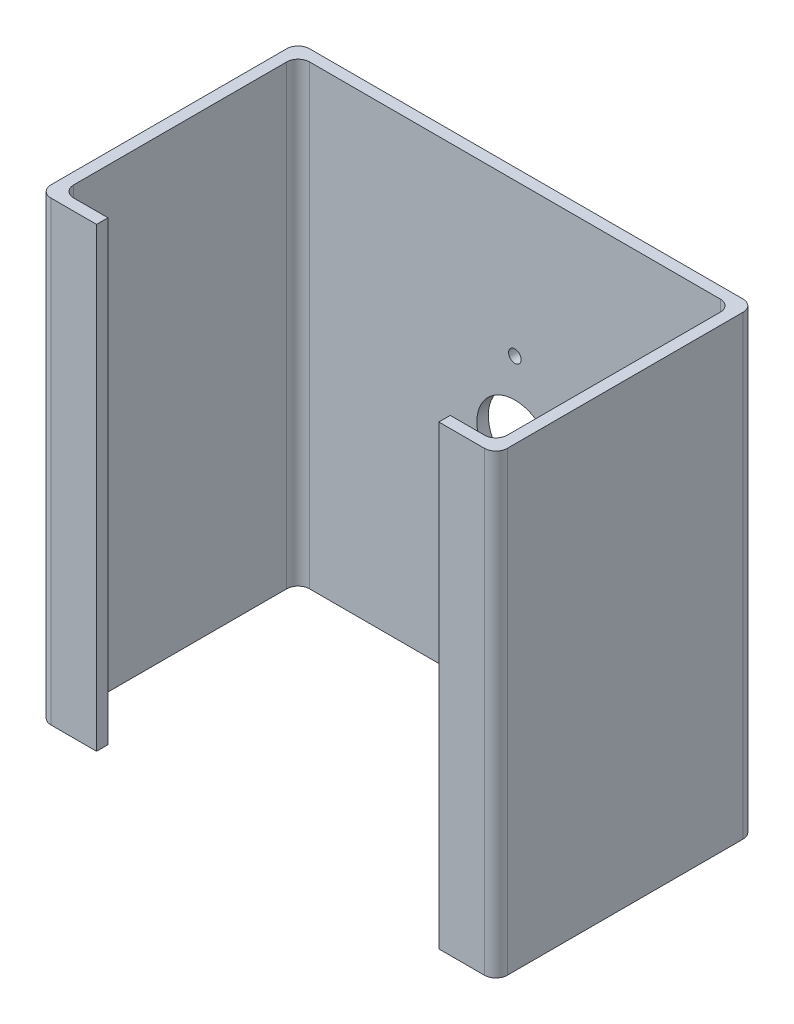
ISO-10303-21;
HEADER;
FILE_DESCRIPTION(('STEP AP214'),'2;1');
FILE_NAME('part.step','',(''),(''),'','','');
FILE_SCHEMA(('AUTOMOTIVE_DESIGN { 1 0 10303 214 1 1 1 1 }'));
ENDSEC;
DATA;
#1=APPLICATION_CONTEXT('core data for automotive mechanical design processes');
#2=APPLICATION_PROTOCOL_DEFINITION('international standard','automotive_design',2000,#1);
#3=PRODUCT_CONTEXT('',#1,'mechanical');
#4=PRODUCT('Part','Part','',(#3));
#5=PRODUCT_RELATED_PRODUCT_CATEGORY('part','',(#4));
#6=PRODUCT_DEFINITION_FORMATION('','',#4);
#7=PRODUCT_DEFINITION_CONTEXT('part definition',#1,'design');
#8=PRODUCT_DEFINITION('design','',#6,#7);
#9=PRODUCT_DEFINITION_SHAPE('','',#8);
#10=(LENGTH_UNIT() NAMED_UNIT(*) SI_UNIT(.MILLI.,.METRE.));
#11=(NAMED_UNIT(*) PLANE_ANGLE_UNIT() SI_UNIT($,.RADIAN.));
#12=(NAMED_UNIT(*) SI_UNIT($,.STERADIAN.) SOLID_ANGLE_UNIT());
#13=UNCERTAINTY_MEASURE_WITH_UNIT(LENGTH_MEASURE(1.E-05),#10,'distance_accuracy_value','');
#14=(GEOMETRIC_REPRESENTATION_CONTEXT(3) GLOBAL_UNCERTAINTY_ASSIGNED_CONTEXT((#13)) GLOBAL_UNIT_ASSIGNED_CONTEXT((#10,
#11,#12)) REPRESENTATION_CONTEXT('',''));
#15=CARTESIAN_POINT('',(0.,0.,0.));
#16=DIRECTION('',(0.,0.,1.));
#17=DIRECTION('',(1.,0.,0.));
#18=AXIS2_PLACEMENT_3D('',#15,#16,#17);
#19=CARTESIAN_POINT('',(0.,-120.,3.00000000000002));
#20=DIRECTION('',(1.,0.,0.));
#21=DIRECTION('',(0.,0.,-1.));
#22=AXIS2_PLACEMENT_3D('',#19,#20,#21);
#23=PLANE('',#22);
#24=DIRECTION('',(0.,0.,-1.));
#25=VECTOR('',#24,1.);
#26=CARTESIAN_POINT('',(0.,0.,3.00000000000002));
#27=LINE('',#26,#25);
#28=CARTESIAN_POINT('',(0.,0.,3.00000000000002));
#29=VERTEX_POINT('',#28);
#30=CARTESIAN_POINT('',(0.,0.,0.));
#31=VERTEX_POINT('',#30);
#32=EDGE_CURVE('E229',#29,#31,#27,.T.);
#33=ORIENTED_EDGE('',*,*,#32,.F.);
#34=DIRECTION('',(0.,1.,0.));
#35=VECTOR('',#34,1.);
#36=CARTESIAN_POINT('',(0.,-120.,3.00000000000002));
#37=LINE('',#36,#35);
#38=CARTESIAN_POINT('',(0.,-120.,3.00000000000002));
#39=VERTEX_POINT('',#38);
#40=EDGE_CURVE('E195',#39,#29,#37,.T.);
#41=ORIENTED_EDGE('',*,*,#40,.F.);
#42=DIRECTION('',(0.,0.,-1.));
#43=VECTOR('',#42,1.);
#44=CARTESIAN_POINT('',(0.,-120.,3.00000000000002));
#45=LINE('',#44,#43);
#46=CARTESIAN_POINT('',(0.,-120.,0.));
#47=VERTEX_POINT('',#46);
#48=EDGE_CURVE('E190',#39,#47,#45,.T.);
#49=ORIENTED_EDGE('',*,*,#48,.T.);
#50=DIRECTION('',(0.,1.,0.));
#51=VECTOR('',#50,1.);
#52=CARTESIAN_POINT('',(0.,-120.,0.));
#53=LINE('',#52,#51);
#54=EDGE_CURVE('E172',#47,#31,#53,.T.);
#55=ORIENTED_EDGE('',*,*,#54,.T.);
#56=EDGE_LOOP('',(#33,#41,#49,#55));
#57=FACE_BOUND('',#56,.T.);
#58=ADVANCED_FACE('F36',(#57),#23,.T.);
#59=CARTESIAN_POINT('',(-15.,-120.,3.00000000000002));
#60=DIRECTION('',(0.,0.,1.));
#61=DIRECTION('',(1.,0.,0.));
#62=AXIS2_PLACEMENT_3D('',#59,#60,#61);
#63=PLANE('',#62);
#64=DIRECTION('',(1.,0.,0.));
#65=VECTOR('',#64,1.);
#66=CARTESIAN_POINT('',(-15.,0.,3.00000000000002));
#67=LINE('',#66,#65);
#68=CARTESIAN_POINT('',(-12.,0.,3.00000000000002));
#69=VERTEX_POINT('',#68);
#70=EDGE_CURVE('E196',#69,#29,#67,.T.);
#71=ORIENTED_EDGE('',*,*,#70,.F.);
#72=DIRECTION('',(0.,1.,0.));
#73=VECTOR('',#72,1.);
#74=CARTESIAN_POINT('',(-12.,-120.,3.00000000000002));
#75=LINE('',#74,#73);
#76=CARTESIAN_POINT('',(-12.,-120.,3.00000000000002));
#77=VERTEX_POINT('',#76);
#78=EDGE_CURVE('E318',#69,#77,#75,.F.);
#79=ORIENTED_EDGE('',*,*,#78,.T.);
#80=DIRECTION('',(1.,0.,0.));
#81=VECTOR('',#80,1.);
#82=CARTESIAN_POINT('',(-15.,-120.,3.00000000000002));
#83=LINE('',#82,#81);
#84=EDGE_CURVE('E184',#77,#39,#83,.T.);
#85=ORIENTED_EDGE('',*,*,#84,.T.);
#86=ORIENTED_EDGE('',*,*,#40,.T.);
#87=EDGE_LOOP('',(#71,#79,#85,#86));
#88=FACE_BOUND('',#87,.T.);
#89=ADVANCED_FACE('F359',(#88),#63,.T.);
#90=CARTESIAN_POINT('',(-15.,-120.,-65.));
#91=DIRECTION('',(-1.,0.,0.));
#92=DIRECTION('',(0.,0.,1.));
#93=AXIS2_PLACEMENT_3D('',#90,#91,#92);
#94=PLANE('',#93);
#95=DIRECTION('',(0.,0.,1.));
#96=VECTOR('',#95,1.);
#97=CARTESIAN_POINT('',(-15.,-120.,-65.));
#98=LINE('',#97,#96);
#99=CARTESIAN_POINT('',(-15.,-120.,-62.));
#100=VERTEX_POINT('',#99);
#101=CARTESIAN_POINT('',(-15.,-120.,0.));
#102=VERTEX_POINT('',#101);
#103=EDGE_CURVE('E225',#100,#102,#98,.T.);
#104=ORIENTED_EDGE('',*,*,#103,.T.);
#105=DIRECTION('',(0.,1.,0.));
#106=VECTOR('',#105,1.);
#107=CARTESIAN_POINT('',(-15.,-120.,0.));
#108=LINE('',#107,#106);
#109=CARTESIAN_POINT('',(-15.,0.,0.));
#110=VERTEX_POINT('',#109);
#111=EDGE_CURVE('E315',#102,#110,#108,.T.);
#112=ORIENTED_EDGE('',*,*,#111,.T.);
#113=DIRECTION('',(0.,0.,1.));
#114=VECTOR('',#113,1.);
#115=CARTESIAN_POINT('',(-15.,0.,-65.));
#116=LINE('',#115,#114);
#117=CARTESIAN_POINT('',(-15.,0.,-62.));
#118=VERTEX_POINT('',#117);
#119=EDGE_CURVE('E198',#118,#110,#116,.T.);
#120=ORIENTED_EDGE('',*,*,#119,.F.);
#121=DIRECTION('',(0.,1.,0.));
#122=VECTOR('',#121,1.);
#123=CARTESIAN_POINT('',(-15.,-120.,-62.));
#124=LINE('',#123,#122);
#125=EDGE_CURVE('E313',#118,#100,#124,.F.);
#126=ORIENTED_EDGE('',*,*,#125,.T.);
#127=EDGE_LOOP('',(#104,#112,#120,#126));
#128=FACE_BOUND('',#127,.T.);
#129=ADVANCED_FACE('F367',(#128),#94,.T.);
#130=CARTESIAN_POINT('',(105.,-120.,-65.));
#131=DIRECTION('',(0.,0.,-1.));
#132=DIRECTION('',(-1.,0.,0.));
#133=AXIS2_PLACEMENT_3D('',#130,#131,#132);
#134=PLANE('',#133);
#135=CARTESIAN_POINT('',(62.3205080756888,-69.9999999999999,-65.));
#136=DIRECTION('',(0.,0.,-1.));
#137=DIRECTION('',(-1.,0.,0.));
#138=AXIS2_PLACEMENT_3D('',#135,#136,#137);
#139=CIRCLE('',#138,1.65);
#140=CARTESIAN_POINT('',(60.6705080756888,-69.9999999999999,-65.));
#141=VERTEX_POINT('',#140);
#142=EDGE_CURVE('E270',#141,#141,#139,.T.);
#143=ORIENTED_EDGE('',*,*,#142,.F.);
#144=EDGE_LOOP('',(#143));
#145=FACE_BOUND('',#144,.T.);
#146=CARTESIAN_POINT('',(45.,-40.,-65.));
#147=DIRECTION('',(0.,0.,-1.));
#148=DIRECTION('',(-1.,0.,0.));
#149=AXIS2_PLACEMENT_3D('',#146,#147,#148);
#150=CIRCLE('',#149,1.65);
#151=CARTESIAN_POINT('',(43.35,-40.,-65.));
#152=VERTEX_POINT('',#151);
#153=EDGE_CURVE('E665',#152,#152,#150,.T.);
#154=ORIENTED_EDGE('',*,*,#153,.F.);
#155=EDGE_LOOP('',(#154));
#156=FACE_BOUND('',#155,.T.);
#157=CARTESIAN_POINT('',(27.6794919243112,-70.0000000000001,-65.));
#158=DIRECTION('',(0.,0.,-1.));
#159=DIRECTION('',(-1.,0.,0.));
#160=AXIS2_PLACEMENT_3D('',#157,#158,#159);
#161=CIRCLE('',#160,1.65000000000001);
#162=CARTESIAN_POINT('',(26.0294919243112,-70.0000000000001,-65.));
#163=VERTEX_POINT('',#162);
#164=EDGE_CURVE('E669',#163,#163,#161,.T.);
#165=ORIENTED_EDGE('',*,*,#164,.F.);
#166=EDGE_LOOP('',(#165));
#167=FACE_BOUND('',#166,.T.);
#168=CARTESIAN_POINT('',(45.,-60.,-65.));
#169=DIRECTION('',(0.,0.,-1.));
#170=DIRECTION('',(-1.,0.,0.));
#171=AXIS2_PLACEMENT_3D('',#168,#169,#170);
#172=CIRCLE('',#171,9.99999999999999);
#173=CARTESIAN_POINT('',(35.,-60.,-65.));
#174=VERTEX_POINT('',#173);
#175=EDGE_CURVE('E201',#174,#174,#172,.T.);
#176=ORIENTED_EDGE('',*,*,#175,.F.);
#177=EDGE_LOOP('',(#176));
#178=FACE_BOUND('',#177,.T.);
#179=DIRECTION('',(-1.,0.,0.));
#180=VECTOR('',#179,1.);
#181=CARTESIAN_POINT('',(105.,0.,-65.));
#182=LINE('',#181,#180);
#183=CARTESIAN_POINT('',(102.,0.,-65.));
#184=VERTEX_POINT('',#183);
#185=CARTESIAN_POINT('',(-12.,0.,-65.));
#186=VERTEX_POINT('',#185);
#187=EDGE_CURVE('E253',#184,#186,#182,.T.);
#188=ORIENTED_EDGE('',*,*,#187,.F.);
#189=DIRECTION('',(0.,1.,0.));
#190=VECTOR('',#189,1.);
#191=CARTESIAN_POINT('',(102.,-120.,-65.));
#192=LINE('',#191,#190);
#193=CARTESIAN_POINT('',(102.,-120.,-65.));
#194=VERTEX_POINT('',#193);
#195=EDGE_CURVE('E328',#184,#194,#192,.F.);
#196=ORIENTED_EDGE('',*,*,#195,.T.);
#197=DIRECTION('',(-1.,0.,0.));
#198=VECTOR('',#197,1.);
#199=CARTESIAN_POINT('',(105.,-120.,-65.));
#200=LINE('',#199,#198);
#201=CARTESIAN_POINT('',(-12.,-120.,-65.));
#202=VERTEX_POINT('',#201);
#203=EDGE_CURVE('E222',#194,#202,#200,.T.);
#204=ORIENTED_EDGE('',*,*,#203,.T.);
#205=DIRECTION('',(0.,1.,0.));
#206=VECTOR('',#205,1.);
#207=CARTESIAN_POINT('',(-12.,-120.,-65.));
#208=LINE('',#207,#206);
#209=EDGE_CURVE('E325',#202,#186,#208,.T.);
#210=ORIENTED_EDGE('',*,*,#209,.T.);
#211=EDGE_LOOP('',(#188,#196,#204,#210));
#212=FACE_BOUND('',#211,.T.);
#213=ADVANCED_FACE('F374',(#145,#156,#167,#178,#212),#134,.T.);
#214=CARTESIAN_POINT('',(105.,-120.,3.));
#215=DIRECTION('',(1.,0.,0.));
#216=DIRECTION('',(0.,0.,-1.));
#217=AXIS2_PLACEMENT_3D('',#214,#215,#216);
#218=PLANE('',#217);
#219=DIRECTION('',(0.,0.,-1.));
#220=VECTOR('',#219,1.);
#221=CARTESIAN_POINT('',(105.,0.,3.));
#222=LINE('',#221,#220);
#223=CARTESIAN_POINT('',(105.,0.,0.));
#224=VERTEX_POINT('',#223);
#225=CARTESIAN_POINT('',(105.,0.,-62.));
#226=VERTEX_POINT('',#225);
#227=EDGE_CURVE('E250',#224,#226,#222,.T.);
#228=ORIENTED_EDGE('',*,*,#227,.F.);
#229=DIRECTION('',(0.,1.,0.));
#230=VECTOR('',#229,1.);
#231=CARTESIAN_POINT('',(105.,-120.,0.));
#232=LINE('',#231,#230);
#233=CARTESIAN_POINT('',(105.,-120.,0.));
#234=VERTEX_POINT('',#233);
#235=EDGE_CURVE('E289',#224,#234,#232,.F.);
#236=ORIENTED_EDGE('',*,*,#235,.T.);
#237=DIRECTION('',(0.,0.,-1.));
#238=VECTOR('',#237,1.);
#239=CARTESIAN_POINT('',(105.,-120.,3.));
#240=LINE('',#239,#238);
#241=CARTESIAN_POINT('',(105.,-120.,-62.));
#242=VERTEX_POINT('',#241);
#243=EDGE_CURVE('E219',#234,#242,#240,.T.);
#244=ORIENTED_EDGE('',*,*,#243,.T.);
#245=DIRECTION('',(0.,1.,0.));
#246=VECTOR('',#245,1.);
#247=CARTESIAN_POINT('',(105.,-120.,-62.));
#248=LINE('',#247,#246);
#249=EDGE_CURVE('E286',#242,#226,#248,.T.);
#250=ORIENTED_EDGE('',*,*,#249,.T.);
#251=EDGE_LOOP('',(#228,#236,#244,#250));
#252=FACE_BOUND('',#251,.T.);
#253=ADVANCED_FACE('F383',(#252),#218,.T.);
#254=CARTESIAN_POINT('',(90.,-120.,3.));
#255=DIRECTION('',(0.,0.,1.));
#256=DIRECTION('',(1.,0.,0.));
#257=AXIS2_PLACEMENT_3D('',#254,#255,#256);
#258=PLANE('',#257);
#259=DIRECTION('',(1.,0.,0.));
#260=VECTOR('',#259,1.);
#261=CARTESIAN_POINT('',(90.,-120.,3.));
#262=LINE('',#261,#260);
#263=CARTESIAN_POINT('',(90.,-120.,3.));
#264=VERTEX_POINT('',#263);
#265=CARTESIAN_POINT('',(102.,-120.,3.));
#266=VERTEX_POINT('',#265);
#267=EDGE_CURVE('E216',#264,#266,#262,.T.);
#268=ORIENTED_EDGE('',*,*,#267,.T.);
#269=DIRECTION('',(0.,1.,0.));
#270=VECTOR('',#269,1.);
#271=CARTESIAN_POINT('',(102.,-120.,3.));
#272=LINE('',#271,#270);
#273=CARTESIAN_POINT('',(102.,0.,3.));
#274=VERTEX_POINT('',#273);
#275=EDGE_CURVE('E259',#266,#274,#272,.T.);
#276=ORIENTED_EDGE('',*,*,#275,.T.);
#277=DIRECTION('',(1.,0.,0.));
#278=VECTOR('',#277,1.);
#279=CARTESIAN_POINT('',(90.,0.,3.));
#280=LINE('',#279,#278);
#281=CARTESIAN_POINT('',(90.,0.,3.));
#282=VERTEX_POINT('',#281);
#283=EDGE_CURVE('E247',#282,#274,#280,.T.);
#284=ORIENTED_EDGE('',*,*,#283,.F.);
#285=DIRECTION('',(0.,1.,0.));
#286=VECTOR('',#285,1.);
#287=CARTESIAN_POINT('',(90.,-120.,3.));
#288=LINE('',#287,#286);
#289=EDGE_CURVE('E260',#264,#282,#288,.T.);
#290=ORIENTED_EDGE('',*,*,#289,.F.);
#291=EDGE_LOOP('',(#268,#276,#284,#290));
#292=FACE_BOUND('',#291,.T.);
#293=ADVANCED_FACE('F391',(#292),#258,.T.);
#294=CARTESIAN_POINT('',(90.,-120.,0.));
#295=DIRECTION('',(-1.,0.,0.));
#296=DIRECTION('',(0.,0.,1.));
#297=AXIS2_PLACEMENT_3D('',#294,#295,#296);
#298=PLANE('',#297);
#299=DIRECTION('',(0.,0.,1.));
#300=VECTOR('',#299,1.);
#301=CARTESIAN_POINT('',(90.,0.,0.));
#302=LINE('',#301,#300);
#303=CARTESIAN_POINT('',(90.,0.,0.));
#304=VERTEX_POINT('',#303);
#305=EDGE_CURVE('E244',#304,#282,#302,.T.);
#306=ORIENTED_EDGE('',*,*,#305,.F.);
#307=DIRECTION('',(0.,1.,0.));
#308=VECTOR('',#307,1.);
#309=CARTESIAN_POINT('',(90.,-120.,0.));
#310=LINE('',#309,#308);
#311=CARTESIAN_POINT('',(90.,-120.,0.));
#312=VERTEX_POINT('',#311);
#313=EDGE_CURVE('E183',#312,#304,#310,.T.);
#314=ORIENTED_EDGE('',*,*,#313,.F.);
#315=DIRECTION('',(0.,0.,1.));
#316=VECTOR('',#315,1.);
#317=CARTESIAN_POINT('',(90.,-120.,0.));
#318=LINE('',#317,#316);
#319=EDGE_CURVE('E213',#312,#264,#318,.T.);
#320=ORIENTED_EDGE('',*,*,#319,.T.);
#321=ORIENTED_EDGE('',*,*,#289,.T.);
#322=EDGE_LOOP('',(#306,#314,#320,#321));
#323=FACE_BOUND('',#322,.T.);
#324=ADVANCED_FACE('F398',(#323),#298,.T.);
#325=CARTESIAN_POINT('',(102.,-120.,0.));
#326=DIRECTION('',(0.,0.,-1.));
#327=DIRECTION('',(-1.,0.,0.));
#328=AXIS2_PLACEMENT_3D('',#325,#326,#327);
#329=PLANE('',#328);
#330=DIRECTION('',(-1.,0.,0.));
#331=VECTOR('',#330,1.);
#332=CARTESIAN_POINT('',(102.,0.,0.));
#333=LINE('',#332,#331);
#334=CARTESIAN_POINT('',(99.,0.,0.));
#335=VERTEX_POINT('',#334);
#336=EDGE_CURVE('E242',#335,#304,#333,.T.);
#337=ORIENTED_EDGE('',*,*,#336,.F.);
#338=DIRECTION('',(0.,1.,0.));
#339=VECTOR('',#338,1.);
#340=CARTESIAN_POINT('',(99.,-120.,0.));
#341=LINE('',#340,#339);
#342=CARTESIAN_POINT('',(99.,-120.,0.));
#343=VERTEX_POINT('',#342);
#344=EDGE_CURVE('E304',#335,#343,#341,.F.);
#345=ORIENTED_EDGE('',*,*,#344,.T.);
#346=DIRECTION('',(-1.,0.,0.));
#347=VECTOR('',#346,1.);
#348=CARTESIAN_POINT('',(102.,-120.,0.));
#349=LINE('',#348,#347);
#350=EDGE_CURVE('E211',#343,#312,#349,.T.);
#351=ORIENTED_EDGE('',*,*,#350,.T.);
#352=ORIENTED_EDGE('',*,*,#313,.T.);
#353=EDGE_LOOP('',(#337,#345,#351,#352));
#354=FACE_BOUND('',#353,.T.);
#355=ADVANCED_FACE('F401',(#354),#329,.T.);
#356=CARTESIAN_POINT('',(102.,-120.,-62.));
#357=DIRECTION('',(-1.,0.,0.));
#358=DIRECTION('',(0.,0.,1.));
#359=AXIS2_PLACEMENT_3D('',#356,#357,#358);
#360=PLANE('',#359);
#361=DIRECTION('',(0.,0.,1.));
#362=VECTOR('',#361,1.);
#363=CARTESIAN_POINT('',(102.,-120.,-62.));
#364=LINE('',#363,#362);
#365=CARTESIAN_POINT('',(102.,-120.,-59.));
#366=VERTEX_POINT('',#365);
#367=CARTESIAN_POINT('',(102.,-120.,-3.00000000000001));
#368=VERTEX_POINT('',#367);
#369=EDGE_CURVE('E208',#366,#368,#364,.T.);
#370=ORIENTED_EDGE('',*,*,#369,.T.);
#371=DIRECTION('',(0.,1.,0.));
#372=VECTOR('',#371,1.);
#373=CARTESIAN_POINT('',(102.,0.,-3.00000000000001));
#374=LINE('',#373,#372);
#375=CARTESIAN_POINT('',(102.,0.,-3.00000000000001));
#376=VERTEX_POINT('',#375);
#377=EDGE_CURVE('E301',#368,#376,#374,.T.);
#378=ORIENTED_EDGE('',*,*,#377,.T.);
#379=DIRECTION('',(0.,0.,1.));
#380=VECTOR('',#379,1.);
#381=CARTESIAN_POINT('',(102.,0.,-62.));
#382=LINE('',#381,#380);
#383=CARTESIAN_POINT('',(102.,0.,-59.));
#384=VERTEX_POINT('',#383);
#385=EDGE_CURVE('E239',#384,#376,#382,.T.);
#386=ORIENTED_EDGE('',*,*,#385,.F.);
#387=DIRECTION('',(0.,1.,0.));
#388=VECTOR('',#387,1.);
#389=CARTESIAN_POINT('',(102.,-120.,-59.));
#390=LINE('',#389,#388);
#391=EDGE_CURVE('E299',#384,#366,#390,.F.);
#392=ORIENTED_EDGE('',*,*,#391,.T.);
#393=EDGE_LOOP('',(#370,#378,#386,#392));
#394=FACE_BOUND('',#393,.T.);
#395=ADVANCED_FACE('F410',(#394),#360,.T.);
#396=CARTESIAN_POINT('',(-12.,-120.,-62.));
#397=DIRECTION('',(0.,0.,1.));
#398=DIRECTION('',(1.,0.,0.));
#399=AXIS2_PLACEMENT_3D('',#396,#397,#398);
#400=PLANE('',#399);
#401=CARTESIAN_POINT('',(62.3205080756888,-69.9999999999999,-62.));
#402=DIRECTION('',(0.,0.,1.));
#403=DIRECTION('',(1.,0.,0.));
#404=AXIS2_PLACEMENT_3D('',#401,#402,#403);
#405=CIRCLE('',#404,1.65);
#406=CARTESIAN_POINT('',(63.9705080756888,-69.9999999999999,-62.));
#407=VERTEX_POINT('',#406);
#408=EDGE_CURVE('E273',#407,#407,#405,.T.);
#409=ORIENTED_EDGE('',*,*,#408,.F.);
#410=EDGE_LOOP('',(#409));
#411=FACE_BOUND('',#410,.T.);
#412=CARTESIAN_POINT('',(45.,-40.,-62.));
#413=DIRECTION('',(0.,0.,1.));
#414=DIRECTION('',(1.,0.,0.));
#415=AXIS2_PLACEMENT_3D('',#412,#413,#414);
#416=CIRCLE('',#415,1.65);
#417=CARTESIAN_POINT('',(46.65,-40.,-62.));
#418=VERTEX_POINT('',#417);
#419=EDGE_CURVE('E269',#418,#418,#416,.T.);
#420=ORIENTED_EDGE('',*,*,#419,.F.);
#421=EDGE_LOOP('',(#420));
#422=FACE_BOUND('',#421,.T.);
#423=CARTESIAN_POINT('',(27.6794919243112,-70.0000000000001,-62.));
#424=DIRECTION('',(0.,0.,1.));
#425=DIRECTION('',(1.,0.,0.));
#426=AXIS2_PLACEMENT_3D('',#423,#424,#425);
#427=CIRCLE('',#426,1.65000000000001);
#428=CARTESIAN_POINT('',(29.3294919243113,-70.0000000000001,-62.));
#429=VERTEX_POINT('',#428);
#430=EDGE_CURVE('E266',#429,#429,#427,.T.);
#431=ORIENTED_EDGE('',*,*,#430,.F.);
#432=EDGE_LOOP('',(#431));
#433=FACE_BOUND('',#432,.T.);
#434=CARTESIAN_POINT('',(45.,-60.,-62.));
#435=DIRECTION('',(0.,0.,1.));
#436=DIRECTION('',(1.,0.,0.));
#437=AXIS2_PLACEMENT_3D('',#434,#435,#436);
#438=CIRCLE('',#437,9.99999999999999);
#439=CARTESIAN_POINT('',(55.,-60.,-62.));
#440=VERTEX_POINT('',#439);
#441=EDGE_CURVE('E231',#440,#440,#438,.T.);
#442=ORIENTED_EDGE('',*,*,#441,.F.);
#443=EDGE_LOOP('',(#442));
#444=FACE_BOUND('',#443,.T.);
#445=DIRECTION('',(1.,0.,0.));
#446=VECTOR('',#445,1.);
#447=CARTESIAN_POINT('',(-12.,-120.,-62.));
#448=LINE('',#447,#446);
#449=CARTESIAN_POINT('',(-9.,-120.,-62.));
#450=VERTEX_POINT('',#449);
#451=CARTESIAN_POINT('',(99.,-120.,-62.));
#452=VERTEX_POINT('',#451);
#453=EDGE_CURVE('E205',#450,#452,#448,.T.);
#454=ORIENTED_EDGE('',*,*,#453,.T.);
#455=DIRECTION('',(0.,1.,0.));
#456=VECTOR('',#455,1.);
#457=CARTESIAN_POINT('',(99.,0.,-62.));
#458=LINE('',#457,#456);
#459=CARTESIAN_POINT('',(99.,0.,-62.));
#460=VERTEX_POINT('',#459);
#461=EDGE_CURVE('E322',#452,#460,#458,.T.);
#462=ORIENTED_EDGE('',*,*,#461,.T.);
#463=DIRECTION('',(1.,0.,0.));
#464=VECTOR('',#463,1.);
#465=CARTESIAN_POINT('',(-12.,0.,-62.));
#466=LINE('',#465,#464);
#467=CARTESIAN_POINT('',(-9.,0.,-62.));
#468=VERTEX_POINT('',#467);
#469=EDGE_CURVE('E236',#468,#460,#466,.T.);
#470=ORIENTED_EDGE('',*,*,#469,.F.);
#471=DIRECTION('',(0.,1.,0.));
#472=VECTOR('',#471,1.);
#473=CARTESIAN_POINT('',(-9.,-120.,-62.));
#474=LINE('',#473,#472);
#475=EDGE_CURVE('E320',#468,#450,#474,.F.);
#476=ORIENTED_EDGE('',*,*,#475,.T.);
#477=EDGE_LOOP('',(#454,#462,#470,#476));
#478=FACE_BOUND('',#477,.T.);
#479=ADVANCED_FACE('F348',(#411,#422,#433,#444,#478),#400,.T.);
#480=CARTESIAN_POINT('',(-12.,-120.,0.));
#481=DIRECTION('',(1.,0.,0.));
#482=DIRECTION('',(0.,0.,-1.));
#483=AXIS2_PLACEMENT_3D('',#480,#481,#482);
#484=PLANE('',#483);
#485=DIRECTION('',(0.,0.,-1.));
#486=VECTOR('',#485,1.);
#487=CARTESIAN_POINT('',(-12.,0.,0.));
#488=LINE('',#487,#486);
#489=CARTESIAN_POINT('',(-12.,0.,-3.));
#490=VERTEX_POINT('',#489);
#491=CARTESIAN_POINT('',(-12.,0.,-59.));
#492=VERTEX_POINT('',#491);
#493=EDGE_CURVE('E233',#490,#492,#488,.T.);
#494=ORIENTED_EDGE('',*,*,#493,.F.);
#495=DIRECTION('',(0.,1.,0.));
#496=VECTOR('',#495,1.);
#497=CARTESIAN_POINT('',(-12.,-120.,-3.));
#498=LINE('',#497,#496);
#499=CARTESIAN_POINT('',(-12.,-120.,-3.));
#500=VERTEX_POINT('',#499);
#501=EDGE_CURVE('E311',#490,#500,#498,.F.);
#502=ORIENTED_EDGE('',*,*,#501,.T.);
#503=DIRECTION('',(0.,0.,-1.));
#504=VECTOR('',#503,1.);
#505=CARTESIAN_POINT('',(-12.,-120.,0.));
#506=LINE('',#505,#504);
#507=CARTESIAN_POINT('',(-12.,-120.,-59.));
#508=VERTEX_POINT('',#507);
#509=EDGE_CURVE('E191',#500,#508,#506,.T.);
#510=ORIENTED_EDGE('',*,*,#509,.T.);
#511=DIRECTION('',(0.,1.,0.));
#512=VECTOR('',#511,1.);
#513=CARTESIAN_POINT('',(-12.,0.,-59.));
#514=LINE('',#513,#512);
#515=EDGE_CURVE('E308',#508,#492,#514,.T.);
#516=ORIENTED_EDGE('',*,*,#515,.T.);
#517=EDGE_LOOP('',(#494,#502,#510,#516));
#518=FACE_BOUND('',#517,.T.);
#519=ADVANCED_FACE('F352',(#518),#484,.T.);
#520=CARTESIAN_POINT('',(0.,-120.,0.));
#521=DIRECTION('',(0.,0.,-1.));
#522=DIRECTION('',(-1.,0.,0.));
#523=AXIS2_PLACEMENT_3D('',#520,#521,#522);
#524=PLANE('',#523);
#525=DIRECTION('',(-1.,0.,0.));
#526=VECTOR('',#525,1.);
#527=CARTESIAN_POINT('',(0.,-120.,0.));
#528=LINE('',#527,#526);
#529=CARTESIAN_POINT('',(-9.,-120.,0.));
#530=VERTEX_POINT('',#529);
#531=EDGE_CURVE('E175',#47,#530,#528,.T.);
#532=ORIENTED_EDGE('',*,*,#531,.T.);
#533=DIRECTION('',(0.,1.,0.));
#534=VECTOR('',#533,1.);
#535=CARTESIAN_POINT('',(-9.,0.,0.));
#536=LINE('',#535,#534);
#537=CARTESIAN_POINT('',(-9.,0.,0.));
#538=VERTEX_POINT('',#537);
#539=EDGE_CURVE('E306',#530,#538,#536,.T.);
#540=ORIENTED_EDGE('',*,*,#539,.T.);
#541=DIRECTION('',(-1.,0.,0.));
#542=VECTOR('',#541,1.);
#543=CARTESIAN_POINT('',(0.,0.,0.));
#544=LINE('',#543,#542);
#545=EDGE_CURVE('E178',#31,#538,#544,.T.);
#546=ORIENTED_EDGE('',*,*,#545,.F.);
#547=ORIENTED_EDGE('',*,*,#54,.F.);
#548=EDGE_LOOP('',(#532,#540,#546,#547));
#549=FACE_BOUND('',#548,.T.);
#550=ADVANCED_FACE('F173',(#549),#524,.T.);
#551=CARTESIAN_POINT('',(0.,-120.,0.));
#552=DIRECTION('',(0.,1.,0.));
#553=DIRECTION('',(0.,0.,1.));
#554=AXIS2_PLACEMENT_3D('',#551,#552,#553);
#555=PLANE('',#554);
#556=ORIENTED_EDGE('',*,*,#243,.F.);
#557=CARTESIAN_POINT('',(102.,-120.,0.));
#558=DIRECTION('',(0.,1.,0.));
#559=DIRECTION('',(0.,0.,1.));
#560=AXIS2_PLACEMENT_3D('',#557,#558,#559);
#561=CIRCLE('',#560,3.);
#562=EDGE_CURVE('E297',#234,#266,#561,.F.);
#563=ORIENTED_EDGE('',*,*,#562,.T.);
#564=ORIENTED_EDGE('',*,*,#267,.F.);
#565=ORIENTED_EDGE('',*,*,#319,.F.);
#566=ORIENTED_EDGE('',*,*,#350,.F.);
#567=CARTESIAN_POINT('',(99.,-120.,-3.00000000000001));
#568=DIRECTION('',(0.,1.,0.));
#569=DIRECTION('',(0.,0.,1.));
#570=AXIS2_PLACEMENT_3D('',#567,#568,#569);
#571=CIRCLE('',#570,3.);
#572=EDGE_CURVE('E332',#343,#368,#571,.T.);
#573=ORIENTED_EDGE('',*,*,#572,.T.);
#574=ORIENTED_EDGE('',*,*,#369,.F.);
#575=CARTESIAN_POINT('',(99.,-120.,-59.));
#576=DIRECTION('',(0.,1.,0.));
#577=DIRECTION('',(0.,0.,1.));
#578=AXIS2_PLACEMENT_3D('',#575,#576,#577);
#579=CIRCLE('',#578,3.);
#580=EDGE_CURVE('E339',#366,#452,#579,.T.);
#581=ORIENTED_EDGE('',*,*,#580,.T.);
#582=ORIENTED_EDGE('',*,*,#453,.F.);
#583=CARTESIAN_POINT('',(-9.,-120.,-59.));
#584=DIRECTION('',(0.,1.,0.));
#585=DIRECTION('',(0.,0.,1.));
#586=AXIS2_PLACEMENT_3D('',#583,#584,#585);
#587=CIRCLE('',#586,3.);
#588=EDGE_CURVE('E11',#450,#508,#587,.T.);
#589=ORIENTED_EDGE('',*,*,#588,.T.);
#590=ORIENTED_EDGE('',*,*,#509,.F.);
#591=CARTESIAN_POINT('',(-9.,-120.,-3.));
#592=DIRECTION('',(0.,1.,0.));
#593=DIRECTION('',(0.,0.,1.));
#594=AXIS2_PLACEMENT_3D('',#591,#592,#593);
#595=CIRCLE('',#594,3.);
#596=EDGE_CURVE('E51',#500,#530,#595,.T.);
#597=ORIENTED_EDGE('',*,*,#596,.T.);
#598=ORIENTED_EDGE('',*,*,#531,.F.);
#599=ORIENTED_EDGE('',*,*,#48,.F.);
#600=ORIENTED_EDGE('',*,*,#84,.F.);
#601=CARTESIAN_POINT('',(-12.,-120.,0.));
#602=DIRECTION('',(0.,1.,0.));
#603=DIRECTION('',(0.,0.,1.));
#604=AXIS2_PLACEMENT_3D('',#601,#602,#603);
#605=CIRCLE('',#604,3.);
#606=EDGE_CURVE('E295',#77,#102,#605,.F.);
#607=ORIENTED_EDGE('',*,*,#606,.T.);
#608=ORIENTED_EDGE('',*,*,#103,.F.);
#609=CARTESIAN_POINT('',(-12.,-120.,-62.));
#610=DIRECTION('',(0.,1.,0.));
#611=DIRECTION('',(0.,0.,1.));
#612=AXIS2_PLACEMENT_3D('',#609,#610,#611);
#613=CIRCLE('',#612,3.);
#614=EDGE_CURVE('E291',#100,#202,#613,.F.);
#615=ORIENTED_EDGE('',*,*,#614,.T.);
#616=ORIENTED_EDGE('',*,*,#203,.F.);
#617=CARTESIAN_POINT('',(102.,-120.,-62.));
#618=DIRECTION('',(0.,1.,0.));
#619=DIRECTION('',(0.,0.,1.));
#620=AXIS2_PLACEMENT_3D('',#617,#618,#619);
#621=CIRCLE('',#620,3.);
#622=EDGE_CURVE('E293',#194,#242,#621,.F.);
#623=ORIENTED_EDGE('',*,*,#622,.T.);
#624=EDGE_LOOP('',(#556,#563,#564,#565,#566,#573,#574,#581,#582,#589,#590,#597,#598,#599,#600,
#607,#608,#615,#616,#623));
#625=FACE_BOUND('',#624,.T.);
#626=ADVANCED_FACE('F188',(#625),#555,.F.);
#627=CARTESIAN_POINT('',(0.,0.,0.));
#628=DIRECTION('',(0.,1.,0.));
#629=DIRECTION('',(0.,0.,1.));
#630=AXIS2_PLACEMENT_3D('',#627,#628,#629);
#631=PLANE('',#630);
#632=ORIENTED_EDGE('',*,*,#283,.T.);
#633=CARTESIAN_POINT('',(102.,0.,0.));
#634=DIRECTION('',(0.,1.,0.));
#635=DIRECTION('',(0.,0.,1.));
#636=AXIS2_PLACEMENT_3D('',#633,#634,#635);
#637=CIRCLE('',#636,3.);
#638=EDGE_CURVE('E284',#274,#224,#637,.T.);
#639=ORIENTED_EDGE('',*,*,#638,.T.);
#640=ORIENTED_EDGE('',*,*,#227,.T.);
#641=CARTESIAN_POINT('',(102.,0.,-62.));
#642=DIRECTION('',(0.,1.,0.));
#643=DIRECTION('',(0.,0.,1.));
#644=AXIS2_PLACEMENT_3D('',#641,#642,#643);
#645=CIRCLE('',#644,3.);
#646=EDGE_CURVE('E280',#226,#184,#645,.T.);
#647=ORIENTED_EDGE('',*,*,#646,.T.);
#648=ORIENTED_EDGE('',*,*,#187,.T.);
#649=CARTESIAN_POINT('',(-12.,0.,-62.));
#650=DIRECTION('',(0.,1.,0.));
#651=DIRECTION('',(0.,0.,1.));
#652=AXIS2_PLACEMENT_3D('',#649,#650,#651);
#653=CIRCLE('',#652,3.);
#654=EDGE_CURVE('E278',#186,#118,#653,.T.);
#655=ORIENTED_EDGE('',*,*,#654,.T.);
#656=ORIENTED_EDGE('',*,*,#119,.T.);
#657=CARTESIAN_POINT('',(-12.,0.,0.));
#658=DIRECTION('',(0.,1.,0.));
#659=DIRECTION('',(0.,0.,1.));
#660=AXIS2_PLACEMENT_3D('',#657,#658,#659);
#661=CIRCLE('',#660,3.);
#662=EDGE_CURVE('E282',#110,#69,#661,.T.);
#663=ORIENTED_EDGE('',*,*,#662,.T.);
#664=ORIENTED_EDGE('',*,*,#70,.T.);
#665=ORIENTED_EDGE('',*,*,#32,.T.);
#666=ORIENTED_EDGE('',*,*,#545,.T.);
#667=CARTESIAN_POINT('',(-9.,0.,-3.));
#668=DIRECTION('',(0.,1.,0.));
#669=DIRECTION('',(0.,0.,1.));
#670=AXIS2_PLACEMENT_3D('',#667,#668,#669);
#671=CIRCLE('',#670,3.);
#672=EDGE_CURVE('E334',#538,#490,#671,.F.);
#673=ORIENTED_EDGE('',*,*,#672,.T.);
#674=ORIENTED_EDGE('',*,*,#493,.T.);
#675=CARTESIAN_POINT('',(-9.,0.,-59.));
#676=DIRECTION('',(0.,1.,0.));
#677=DIRECTION('',(0.,0.,1.));
#678=AXIS2_PLACEMENT_3D('',#675,#676,#677);
#679=CIRCLE('',#678,3.);
#680=EDGE_CURVE('E44',#492,#468,#679,.F.);
#681=ORIENTED_EDGE('',*,*,#680,.T.);
#682=ORIENTED_EDGE('',*,*,#469,.T.);
#683=CARTESIAN_POINT('',(99.,0.,-59.));
#684=DIRECTION('',(0.,1.,0.));
#685=DIRECTION('',(0.,0.,1.));
#686=AXIS2_PLACEMENT_3D('',#683,#684,#685);
#687=CIRCLE('',#686,3.);
#688=EDGE_CURVE('E337',#460,#384,#687,.F.);
#689=ORIENTED_EDGE('',*,*,#688,.T.);
#690=ORIENTED_EDGE('',*,*,#385,.T.);
#691=CARTESIAN_POINT('',(99.,0.,-3.00000000000001));
#692=DIRECTION('',(0.,1.,0.));
#693=DIRECTION('',(0.,0.,1.));
#694=AXIS2_PLACEMENT_3D('',#691,#692,#693);
#695=CIRCLE('',#694,3.);
#696=EDGE_CURVE('E330',#376,#335,#695,.F.);
#697=ORIENTED_EDGE('',*,*,#696,.T.);
#698=ORIENTED_EDGE('',*,*,#336,.T.);
#699=ORIENTED_EDGE('',*,*,#305,.T.);
#700=EDGE_LOOP('',(#632,#639,#640,#647,#648,#655,#656,#663,#664,#665,#666,#673,#674,#681,#682,
#689,#690,#697,#698,#699));
#701=FACE_BOUND('',#700,.T.);
#702=ADVANCED_FACE('F342',(#701),#631,.T.);
#703=CARTESIAN_POINT('',(45.,-60.,-55.));
#704=DIRECTION('',(0.,0.,-1.));
#705=DIRECTION('',(-1.,0.,0.));
#706=AXIS2_PLACEMENT_3D('',#703,#704,#705);
#707=CYLINDRICAL_SURFACE('',#706,9.99999999999999);
#708=ORIENTED_EDGE('',*,*,#441,.T.);
#709=EDGE_LOOP('',(#708));
#710=FACE_BOUND('',#709,.T.);
#711=ORIENTED_EDGE('',*,*,#175,.T.);
#712=EDGE_LOOP('',(#711));
#713=FACE_BOUND('',#712,.T.);
#714=ADVANCED_FACE('F511',(#710,#713),#707,.F.);
#715=CARTESIAN_POINT('',(27.6794919243112,-70.0000000000001,-55.));
#716=DIRECTION('',(0.,0.,-1.));
#717=DIRECTION('',(-1.,0.,0.));
#718=AXIS2_PLACEMENT_3D('',#715,#716,#717);
#719=CYLINDRICAL_SURFACE('',#718,1.65000000000001);
#720=ORIENTED_EDGE('',*,*,#430,.T.);
#721=EDGE_LOOP('',(#720));
#722=FACE_BOUND('',#721,.T.);
#723=ORIENTED_EDGE('',*,*,#164,.T.);
#724=EDGE_LOOP('',(#723));
#725=FACE_BOUND('',#724,.T.);
#726=ADVANCED_FACE('F502',(#722,#725),#719,.F.);
#727=CARTESIAN_POINT('',(45.,-40.,-55.));
#728=DIRECTION('',(0.,0.,-1.));
#729=DIRECTION('',(-1.,0.,0.));
#730=AXIS2_PLACEMENT_3D('',#727,#728,#729);
#731=CYLINDRICAL_SURFACE('',#730,1.65);
#732=ORIENTED_EDGE('',*,*,#419,.T.);
#733=EDGE_LOOP('',(#732));
#734=FACE_BOUND('',#733,.T.);
#735=ORIENTED_EDGE('',*,*,#153,.T.);
#736=EDGE_LOOP('',(#735));
#737=FACE_BOUND('',#736,.T.);
#738=ADVANCED_FACE('F492',(#734,#737),#731,.F.);
#739=CARTESIAN_POINT('',(62.3205080756888,-69.9999999999999,-55.));
#740=DIRECTION('',(0.,0.,-1.));
#741=DIRECTION('',(-1.,0.,0.));
#742=AXIS2_PLACEMENT_3D('',#739,#740,#741);
#743=CYLINDRICAL_SURFACE('',#742,1.65);
#744=ORIENTED_EDGE('',*,*,#408,.T.);
#745=EDGE_LOOP('',(#744));
#746=FACE_BOUND('',#745,.T.);
#747=ORIENTED_EDGE('',*,*,#142,.T.);
#748=EDGE_LOOP('',(#747));
#749=FACE_BOUND('',#748,.T.);
#750=ADVANCED_FACE('F434',(#746,#749),#743,.F.);
#751=CARTESIAN_POINT('',(102.,-120.,0.));
#752=DIRECTION('',(0.,1.,0.));
#753=DIRECTION('',(0.,0.,1.));
#754=AXIS2_PLACEMENT_3D('',#751,#752,#753);
#755=CYLINDRICAL_SURFACE('',#754,3.);
#756=ORIENTED_EDGE('',*,*,#562,.F.);
#757=ORIENTED_EDGE('',*,*,#235,.F.);
#758=ORIENTED_EDGE('',*,*,#638,.F.);
#759=ORIENTED_EDGE('',*,*,#275,.F.);
#760=EDGE_LOOP('',(#756,#757,#758,#759));
#761=FACE_BOUND('',#760,.T.);
#762=ADVANCED_FACE('F389',(#761),#755,.T.);
#763=CARTESIAN_POINT('',(99.,-120.,-3.00000000000001));
#764=DIRECTION('',(0.,-1.,0.));
#765=DIRECTION('',(0.,0.,-1.));
#766=AXIS2_PLACEMENT_3D('',#763,#764,#765);
#767=CYLINDRICAL_SURFACE('',#766,3.);
#768=ORIENTED_EDGE('',*,*,#572,.F.);
#769=ORIENTED_EDGE('',*,*,#344,.F.);
#770=ORIENTED_EDGE('',*,*,#696,.F.);
#771=ORIENTED_EDGE('',*,*,#377,.F.);
#772=EDGE_LOOP('',(#768,#769,#770,#771));
#773=FACE_BOUND('',#772,.T.);
#774=ADVANCED_FACE('F407',(#773),#767,.F.);
#775=CARTESIAN_POINT('',(-9.,-120.,-3.));
#776=DIRECTION('',(0.,-1.,0.));
#777=DIRECTION('',(0.,0.,-1.));
#778=AXIS2_PLACEMENT_3D('',#775,#776,#777);
#779=CYLINDRICAL_SURFACE('',#778,3.);
#780=ORIENTED_EDGE('',*,*,#596,.F.);
#781=ORIENTED_EDGE('',*,*,#501,.F.);
#782=ORIENTED_EDGE('',*,*,#672,.F.);
#783=ORIENTED_EDGE('',*,*,#539,.F.);
#784=EDGE_LOOP('',(#780,#781,#782,#783));
#785=FACE_BOUND('',#784,.T.);
#786=ADVANCED_FACE('F355',(#785),#779,.F.);
#787=CARTESIAN_POINT('',(-12.,-120.,0.));
#788=DIRECTION('',(0.,1.,0.));
#789=DIRECTION('',(0.,0.,1.));
#790=AXIS2_PLACEMENT_3D('',#787,#788,#789);
#791=CYLINDRICAL_SURFACE('',#790,3.);
#792=ORIENTED_EDGE('',*,*,#606,.F.);
#793=ORIENTED_EDGE('',*,*,#78,.F.);
#794=ORIENTED_EDGE('',*,*,#662,.F.);
#795=ORIENTED_EDGE('',*,*,#111,.F.);
#796=EDGE_LOOP('',(#792,#793,#794,#795));
#797=FACE_BOUND('',#796,.T.);
#798=ADVANCED_FACE('F364',(#797),#791,.T.);
#799=CARTESIAN_POINT('',(99.,-120.,-59.));
#800=DIRECTION('',(0.,-1.,0.));
#801=DIRECTION('',(0.,0.,-1.));
#802=AXIS2_PLACEMENT_3D('',#799,#800,#801);
#803=CYLINDRICAL_SURFACE('',#802,3.);
#804=ORIENTED_EDGE('',*,*,#580,.F.);
#805=ORIENTED_EDGE('',*,*,#391,.F.);
#806=ORIENTED_EDGE('',*,*,#688,.F.);
#807=ORIENTED_EDGE('',*,*,#461,.F.);
#808=EDGE_LOOP('',(#804,#805,#806,#807));
#809=FACE_BOUND('',#808,.T.);
#810=ADVANCED_FACE('F414',(#809),#803,.F.);
#811=CARTESIAN_POINT('',(-9.,-120.,-59.));
#812=DIRECTION('',(0.,-1.,0.));
#813=DIRECTION('',(0.,0.,-1.));
#814=AXIS2_PLACEMENT_3D('',#811,#812,#813);
#815=CYLINDRICAL_SURFACE('',#814,3.);
#816=ORIENTED_EDGE('',*,*,#588,.F.);
#817=ORIENTED_EDGE('',*,*,#475,.F.);
#818=ORIENTED_EDGE('',*,*,#680,.F.);
#819=ORIENTED_EDGE('',*,*,#515,.F.);
#820=EDGE_LOOP('',(#816,#817,#818,#819));
#821=FACE_BOUND('',#820,.T.);
#822=ADVANCED_FACE('F350',(#821),#815,.F.);
#823=CARTESIAN_POINT('',(102.,-120.,-62.));
#824=DIRECTION('',(0.,1.,0.));
#825=DIRECTION('',(0.,0.,1.));
#826=AXIS2_PLACEMENT_3D('',#823,#824,#825);
#827=CYLINDRICAL_SURFACE('',#826,3.);
#828=ORIENTED_EDGE('',*,*,#622,.F.);
#829=ORIENTED_EDGE('',*,*,#195,.F.);
#830=ORIENTED_EDGE('',*,*,#646,.F.);
#831=ORIENTED_EDGE('',*,*,#249,.F.);
#832=EDGE_LOOP('',(#828,#829,#830,#831));
#833=FACE_BOUND('',#832,.T.);
#834=ADVANCED_FACE('F380',(#833),#827,.T.);
#835=CARTESIAN_POINT('',(-12.,-120.,-62.));
#836=DIRECTION('',(0.,1.,0.));
#837=DIRECTION('',(0.,0.,1.));
#838=AXIS2_PLACEMENT_3D('',#835,#836,#837);
#839=CYLINDRICAL_SURFACE('',#838,3.);
#840=ORIENTED_EDGE('',*,*,#614,.F.);
#841=ORIENTED_EDGE('',*,*,#125,.F.);
#842=ORIENTED_EDGE('',*,*,#654,.F.);
#843=ORIENTED_EDGE('',*,*,#209,.F.);
#844=EDGE_LOOP('',(#840,#841,#842,#843));
#845=FACE_BOUND('',#844,.T.);
#846=ADVANCED_FACE('F38',(#845),#839,.T.);
#847=CLOSED_SHELL('',(#58,#89,#129,#213,#253,#293,#324,#355,#395,#479,#519,#550,#626,#702,#714,
#726,#738,#750,#762,#774,#786,#798,#810,#822,#834,#846));
#848=MANIFOLD_SOLID_BREP('B2',#847);
#849=ADVANCED_BREP_SHAPE_REPRESENTATION('',(#18,#848),#14);
#850=SHAPE_DEFINITION_REPRESENTATION(#9,#849);
ENDSEC;
END-ISO-10303-21;
